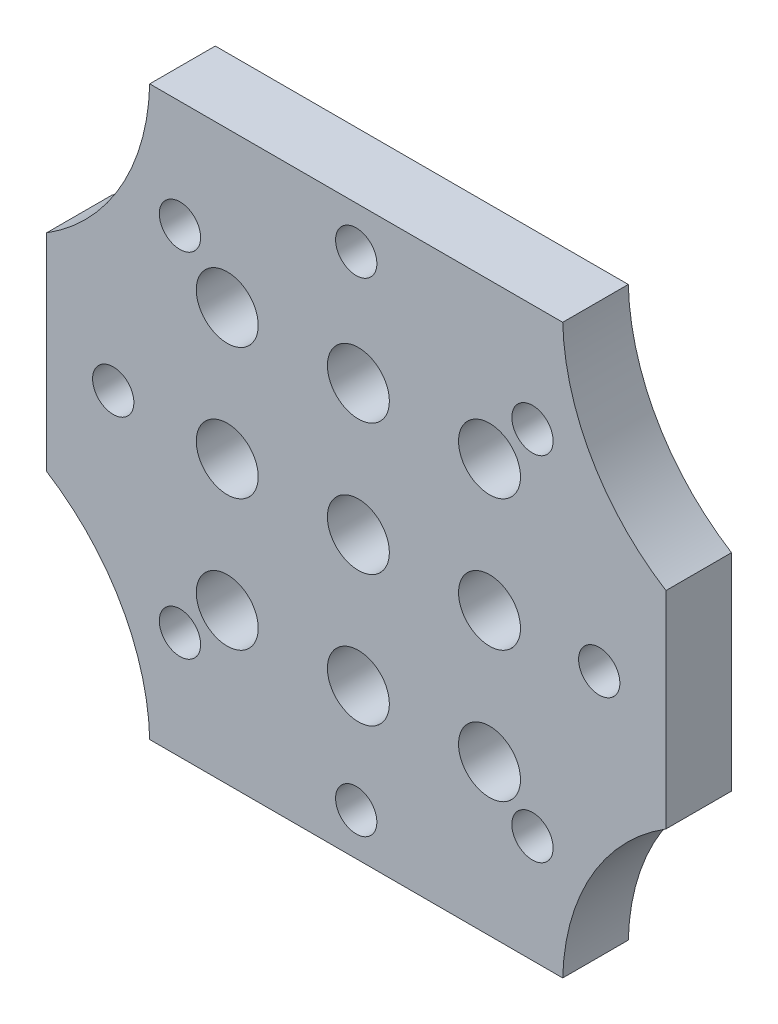
ISO-10303-21;
HEADER;
FILE_DESCRIPTION(('STEP AP214'),'2;1');
FILE_NAME('part.step','',(''),(''),'','','');
FILE_SCHEMA(('AUTOMOTIVE_DESIGN { 1 0 10303 214 1 1 1 1 }'));
ENDSEC;
DATA;
#1=APPLICATION_CONTEXT('core data for automotive mechanical design processes');
#2=APPLICATION_PROTOCOL_DEFINITION('international standard','automotive_design',2000,#1);
#3=PRODUCT_CONTEXT('',#1,'mechanical');
#4=PRODUCT('Part','Part','',(#3));
#5=PRODUCT_RELATED_PRODUCT_CATEGORY('part','',(#4));
#6=PRODUCT_DEFINITION_FORMATION('','',#4);
#7=PRODUCT_DEFINITION_CONTEXT('part definition',#1,'design');
#8=PRODUCT_DEFINITION('design','',#6,#7);
#9=PRODUCT_DEFINITION_SHAPE('','',#8);
#10=(LENGTH_UNIT() NAMED_UNIT(*) SI_UNIT(.MILLI.,.METRE.));
#11=(NAMED_UNIT(*) PLANE_ANGLE_UNIT() SI_UNIT($,.RADIAN.));
#12=(NAMED_UNIT(*) SI_UNIT($,.STERADIAN.) SOLID_ANGLE_UNIT());
#13=UNCERTAINTY_MEASURE_WITH_UNIT(LENGTH_MEASURE(1.E-05),#10,'distance_accuracy_value','');
#14=(GEOMETRIC_REPRESENTATION_CONTEXT(3) GLOBAL_UNCERTAINTY_ASSIGNED_CONTEXT((#13)) GLOBAL_UNIT_ASSIGNED_CONTEXT((#10,
#11,#12)) REPRESENTATION_CONTEXT('',''));
#15=CARTESIAN_POINT('',(0.,0.,0.));
#16=DIRECTION('',(0.,0.,1.));
#17=DIRECTION('',(1.,0.,0.));
#18=AXIS2_PLACEMENT_3D('',#15,#16,#17);
#19=CARTESIAN_POINT('',(30.,-27.5,6.35));
#20=DIRECTION('',(-1.,0.,0.));
#21=DIRECTION('',(0.,0.,1.));
#22=AXIS2_PLACEMENT_3D('',#19,#20,#21);
#23=PLANE('',#22);
#24=DIRECTION('',(0.,0.,1.));
#25=VECTOR('',#24,1.);
#26=CARTESIAN_POINT('',(30.,10.,0.));
#27=LINE('',#26,#25);
#28=CARTESIAN_POINT('',(30.,10.,0.));
#29=VERTEX_POINT('',#28);
#30=CARTESIAN_POINT('',(30.,10.,6.35));
#31=VERTEX_POINT('',#30);
#32=EDGE_CURVE('E161',#29,#31,#27,.T.);
#33=ORIENTED_EDGE('',*,*,#32,.T.);
#34=DIRECTION('',(0.,1.,0.));
#35=VECTOR('',#34,1.);
#36=CARTESIAN_POINT('',(30.,-27.5,6.35));
#37=LINE('',#36,#35);
#38=CARTESIAN_POINT('',(30.,-10.,6.35));
#39=VERTEX_POINT('',#38);
#40=EDGE_CURVE('E129',#39,#31,#37,.T.);
#41=ORIENTED_EDGE('',*,*,#40,.F.);
#42=DIRECTION('',(0.,0.,1.));
#43=VECTOR('',#42,1.);
#44=CARTESIAN_POINT('',(30.,-10.,0.));
#45=LINE('',#44,#43);
#46=CARTESIAN_POINT('',(30.,-10.,0.));
#47=VERTEX_POINT('',#46);
#48=EDGE_CURVE('E171',#47,#39,#45,.T.);
#49=ORIENTED_EDGE('',*,*,#48,.F.);
#50=DIRECTION('',(0.,1.,0.));
#51=VECTOR('',#50,1.);
#52=CARTESIAN_POINT('',(30.,-27.5,0.));
#53=LINE('',#52,#51);
#54=EDGE_CURVE('E138',#47,#29,#53,.T.);
#55=ORIENTED_EDGE('',*,*,#54,.T.);
#56=EDGE_LOOP('',(#33,#41,#49,#55));
#57=FACE_BOUND('',#56,.T.);
#58=ADVANCED_FACE('F43',(#57),#23,.F.);
#59=CARTESIAN_POINT('',(-30.,27.5,6.35));
#60=DIRECTION('',(0.,-1.,0.));
#61=DIRECTION('',(0.,0.,-1.));
#62=AXIS2_PLACEMENT_3D('',#59,#60,#61);
#63=PLANE('',#62);
#64=DIRECTION('',(0.,0.,1.));
#65=VECTOR('',#64,1.);
#66=CARTESIAN_POINT('',(20.,27.5,0.));
#67=LINE('',#66,#65);
#68=CARTESIAN_POINT('',(20.,27.5,0.));
#69=VERTEX_POINT('',#68);
#70=CARTESIAN_POINT('',(20.,27.5,6.35));
#71=VERTEX_POINT('',#70);
#72=EDGE_CURVE('E164',#69,#71,#67,.T.);
#73=ORIENTED_EDGE('',*,*,#72,.F.);
#74=DIRECTION('',(-1.,0.,0.));
#75=VECTOR('',#74,1.);
#76=CARTESIAN_POINT('',(-30.,27.5,0.));
#77=LINE('',#76,#75);
#78=CARTESIAN_POINT('',(-20.,27.5,0.));
#79=VERTEX_POINT('',#78);
#80=EDGE_CURVE('E134',#69,#79,#77,.T.);
#81=ORIENTED_EDGE('',*,*,#80,.T.);
#82=DIRECTION('',(0.,0.,1.));
#83=VECTOR('',#82,1.);
#84=CARTESIAN_POINT('',(-20.,27.5,0.));
#85=LINE('',#84,#83);
#86=CARTESIAN_POINT('',(-20.,27.5,6.35));
#87=VERTEX_POINT('',#86);
#88=EDGE_CURVE('E59',#79,#87,#85,.T.);
#89=ORIENTED_EDGE('',*,*,#88,.T.);
#90=DIRECTION('',(-1.,0.,0.));
#91=VECTOR('',#90,1.);
#92=CARTESIAN_POINT('',(-30.,27.5,6.35));
#93=LINE('',#92,#91);
#94=EDGE_CURVE('E132',#71,#87,#93,.T.);
#95=ORIENTED_EDGE('',*,*,#94,.F.);
#96=EDGE_LOOP('',(#73,#81,#89,#95));
#97=FACE_BOUND('',#96,.T.);
#98=ADVANCED_FACE('F327',(#97),#63,.F.);
#99=CARTESIAN_POINT('',(-30.,-27.5,6.35));
#100=DIRECTION('',(1.,0.,0.));
#101=DIRECTION('',(0.,0.,-1.));
#102=AXIS2_PLACEMENT_3D('',#99,#100,#101);
#103=PLANE('',#102);
#104=DIRECTION('',(0.,0.,1.));
#105=VECTOR('',#104,1.);
#106=CARTESIAN_POINT('',(-30.,-9.99999999999999,0.));
#107=LINE('',#106,#105);
#108=CARTESIAN_POINT('',(-30.,-9.99999999999999,0.));
#109=VERTEX_POINT('',#108);
#110=CARTESIAN_POINT('',(-30.,-9.99999999999999,6.35));
#111=VERTEX_POINT('',#110);
#112=EDGE_CURVE('E67',#109,#111,#107,.T.);
#113=ORIENTED_EDGE('',*,*,#112,.T.);
#114=DIRECTION('',(0.,-1.,0.));
#115=VECTOR('',#114,1.);
#116=CARTESIAN_POINT('',(-30.,-27.5,6.35));
#117=LINE('',#116,#115);
#118=CARTESIAN_POINT('',(-30.,9.99999999999999,6.35));
#119=VERTEX_POINT('',#118);
#120=EDGE_CURVE('E51',#119,#111,#117,.T.);
#121=ORIENTED_EDGE('',*,*,#120,.F.);
#122=DIRECTION('',(0.,0.,1.));
#123=VECTOR('',#122,1.);
#124=CARTESIAN_POINT('',(-30.,9.99999999999999,0.));
#125=LINE('',#124,#123);
#126=CARTESIAN_POINT('',(-30.,9.99999999999999,0.));
#127=VERTEX_POINT('',#126);
#128=EDGE_CURVE('E147',#127,#119,#125,.T.);
#129=ORIENTED_EDGE('',*,*,#128,.F.);
#130=DIRECTION('',(0.,-1.,0.));
#131=VECTOR('',#130,1.);
#132=CARTESIAN_POINT('',(-30.,-27.5,0.));
#133=LINE('',#132,#131);
#134=EDGE_CURVE('E130',#127,#109,#133,.T.);
#135=ORIENTED_EDGE('',*,*,#134,.T.);
#136=EDGE_LOOP('',(#113,#121,#129,#135));
#137=FACE_BOUND('',#136,.T.);
#138=ADVANCED_FACE('F331',(#137),#103,.F.);
#139=CARTESIAN_POINT('',(-30.,-27.5,6.35));
#140=DIRECTION('',(0.,1.,0.));
#141=DIRECTION('',(0.,0.,1.));
#142=AXIS2_PLACEMENT_3D('',#139,#140,#141);
#143=PLANE('',#142);
#144=DIRECTION('',(1.,0.,0.));
#145=VECTOR('',#144,1.);
#146=CARTESIAN_POINT('',(-30.,-27.5,0.));
#147=LINE('',#146,#145);
#148=CARTESIAN_POINT('',(-20.,-27.5,0.));
#149=VERTEX_POINT('',#148);
#150=CARTESIAN_POINT('',(20.,-27.5,0.));
#151=VERTEX_POINT('',#150);
#152=EDGE_CURVE('E46',#149,#151,#147,.T.);
#153=ORIENTED_EDGE('',*,*,#152,.T.);
#154=DIRECTION('',(0.,0.,1.));
#155=VECTOR('',#154,1.);
#156=CARTESIAN_POINT('',(20.,-27.5,0.));
#157=LINE('',#156,#155);
#158=CARTESIAN_POINT('',(20.,-27.5,6.35));
#159=VERTEX_POINT('',#158);
#160=EDGE_CURVE('E173',#151,#159,#157,.T.);
#161=ORIENTED_EDGE('',*,*,#160,.T.);
#162=DIRECTION('',(1.,0.,0.));
#163=VECTOR('',#162,1.);
#164=CARTESIAN_POINT('',(-30.,-27.5,6.35));
#165=LINE('',#164,#163);
#166=CARTESIAN_POINT('',(-20.,-27.5,6.35));
#167=VERTEX_POINT('',#166);
#168=EDGE_CURVE('E11',#167,#159,#165,.T.);
#169=ORIENTED_EDGE('',*,*,#168,.F.);
#170=DIRECTION('',(0.,0.,1.));
#171=VECTOR('',#170,1.);
#172=CARTESIAN_POINT('',(-20.,-27.5,0.));
#173=LINE('',#172,#171);
#174=EDGE_CURVE('E109',#149,#167,#173,.T.);
#175=ORIENTED_EDGE('',*,*,#174,.F.);
#176=EDGE_LOOP('',(#153,#161,#169,#175));
#177=FACE_BOUND('',#176,.T.);
#178=ADVANCED_FACE('F120',(#177),#143,.F.);
#179=CARTESIAN_POINT('',(0.,0.,6.35));
#180=DIRECTION('',(0.,0.,-1.));
#181=DIRECTION('',(-1.,0.,0.));
#182=AXIS2_PLACEMENT_3D('',#179,#180,#181);
#183=PLANE('',#182);
#184=CARTESIAN_POINT('',(-12.4909155258027,-12.9090844741973,6.35));
#185=DIRECTION('',(0.,0.,1.));
#186=DIRECTION('',(1.,0.,0.));
#187=AXIS2_PLACEMENT_3D('',#184,#185,#186);
#188=CIRCLE('',#187,3.);
#189=CARTESIAN_POINT('',(-9.49091552580268,-12.9090844741973,6.35));
#190=VERTEX_POINT('',#189);
#191=EDGE_CURVE('E269',#190,#190,#188,.T.);
#192=ORIENTED_EDGE('',*,*,#191,.F.);
#193=EDGE_LOOP('',(#192));
#194=FACE_BOUND('',#193,.T.);
#195=CARTESIAN_POINT('',(0.209084474197315,-12.9090844741973,6.35));
#196=DIRECTION('',(0.,0.,1.));
#197=DIRECTION('',(1.,0.,0.));
#198=AXIS2_PLACEMENT_3D('',#195,#196,#197);
#199=CIRCLE('',#198,3.);
#200=CARTESIAN_POINT('',(3.20908447419732,-12.9090844741973,6.35));
#201=VERTEX_POINT('',#200);
#202=EDGE_CURVE('E263',#201,#201,#199,.T.);
#203=ORIENTED_EDGE('',*,*,#202,.F.);
#204=EDGE_LOOP('',(#203));
#205=FACE_BOUND('',#204,.T.);
#206=CARTESIAN_POINT('',(12.9090844741973,-12.9090844741973,6.35));
#207=DIRECTION('',(0.,0.,1.));
#208=DIRECTION('',(1.,0.,0.));
#209=AXIS2_PLACEMENT_3D('',#206,#207,#208);
#210=CIRCLE('',#209,3.);
#211=CARTESIAN_POINT('',(15.9090844741973,-12.9090844741973,6.35));
#212=VERTEX_POINT('',#211);
#213=EDGE_CURVE('E257',#212,#212,#210,.T.);
#214=ORIENTED_EDGE('',*,*,#213,.F.);
#215=EDGE_LOOP('',(#214));
#216=FACE_BOUND('',#215,.T.);
#217=CARTESIAN_POINT('',(-12.4909155258027,-0.209084474197327,6.35));
#218=DIRECTION('',(0.,0.,1.));
#219=DIRECTION('',(1.,0.,0.));
#220=AXIS2_PLACEMENT_3D('',#217,#218,#219);
#221=CIRCLE('',#220,3.);
#222=CARTESIAN_POINT('',(-9.49091552580268,-0.209084474197327,6.35));
#223=VERTEX_POINT('',#222);
#224=EDGE_CURVE('E252',#223,#223,#221,.T.);
#225=ORIENTED_EDGE('',*,*,#224,.F.);
#226=EDGE_LOOP('',(#225));
#227=FACE_BOUND('',#226,.T.);
#228=CARTESIAN_POINT('',(0.209084474197319,-0.209084474197326,6.35));
#229=DIRECTION('',(0.,0.,1.));
#230=DIRECTION('',(1.,0.,0.));
#231=AXIS2_PLACEMENT_3D('',#228,#229,#230);
#232=CIRCLE('',#231,3.);
#233=CARTESIAN_POINT('',(3.20908447419732,-0.209084474197326,6.35));
#234=VERTEX_POINT('',#233);
#235=EDGE_CURVE('E246',#234,#234,#232,.T.);
#236=ORIENTED_EDGE('',*,*,#235,.F.);
#237=EDGE_LOOP('',(#236));
#238=FACE_BOUND('',#237,.T.);
#239=CARTESIAN_POINT('',(12.9090844741973,-0.209084474197322,6.35));
#240=DIRECTION('',(0.,0.,1.));
#241=DIRECTION('',(1.,0.,0.));
#242=AXIS2_PLACEMENT_3D('',#239,#240,#241);
#243=CIRCLE('',#242,3.);
#244=CARTESIAN_POINT('',(15.9090844741973,-0.209084474197322,6.35));
#245=VERTEX_POINT('',#244);
#246=EDGE_CURVE('E239',#245,#245,#243,.T.);
#247=ORIENTED_EDGE('',*,*,#246,.F.);
#248=EDGE_LOOP('',(#247));
#249=FACE_BOUND('',#248,.T.);
#250=CARTESIAN_POINT('',(0.209084474197324,12.4909155258027,6.35));
#251=DIRECTION('',(0.,0.,1.));
#252=DIRECTION('',(1.,0.,0.));
#253=AXIS2_PLACEMENT_3D('',#250,#251,#252);
#254=CIRCLE('',#253,3.);
#255=CARTESIAN_POINT('',(3.20908447419733,12.4909155258027,6.35));
#256=VERTEX_POINT('',#255);
#257=EDGE_CURVE('E234',#256,#256,#254,.T.);
#258=ORIENTED_EDGE('',*,*,#257,.F.);
#259=EDGE_LOOP('',(#258));
#260=FACE_BOUND('',#259,.T.);
#261=CARTESIAN_POINT('',(12.9090844741973,12.4909155258027,6.35));
#262=DIRECTION('',(0.,0.,1.));
#263=DIRECTION('',(1.,0.,0.));
#264=AXIS2_PLACEMENT_3D('',#261,#262,#263);
#265=CIRCLE('',#264,3.);
#266=CARTESIAN_POINT('',(15.9090844741973,12.4909155258027,6.35));
#267=VERTEX_POINT('',#266);
#268=EDGE_CURVE('E227',#267,#267,#265,.T.);
#269=ORIENTED_EDGE('',*,*,#268,.F.);
#270=EDGE_LOOP('',(#269));
#271=FACE_BOUND('',#270,.T.);
#272=CARTESIAN_POINT('',(-12.4909155258027,12.4909155258027,6.35));
#273=DIRECTION('',(0.,0.,1.));
#274=DIRECTION('',(1.,0.,0.));
#275=AXIS2_PLACEMENT_3D('',#272,#273,#274);
#276=CIRCLE('',#275,3.);
#277=CARTESIAN_POINT('',(-9.49091552580268,12.4909155258027,6.35));
#278=VERTEX_POINT('',#277);
#279=EDGE_CURVE('E221',#278,#278,#276,.T.);
#280=ORIENTED_EDGE('',*,*,#279,.F.);
#281=EDGE_LOOP('',(#280));
#282=FACE_BOUND('',#281,.T.);
#283=CARTESIAN_POINT('',(-23.535533905,0.,6.35));
#284=DIRECTION('',(0.,0.,1.));
#285=DIRECTION('',(1.,0.,0.));
#286=AXIS2_PLACEMENT_3D('',#283,#284,#285);
#287=CIRCLE('',#286,2.);
#288=CARTESIAN_POINT('',(-21.535533905,0.,6.35));
#289=VERTEX_POINT('',#288);
#290=EDGE_CURVE('E179',#289,#289,#287,.T.);
#291=ORIENTED_EDGE('',*,*,#290,.F.);
#292=EDGE_LOOP('',(#291));
#293=FACE_BOUND('',#292,.T.);
#294=CARTESIAN_POINT('',(-17.07106781,-17.07106781,6.35));
#295=DIRECTION('',(0.,0.,1.));
#296=DIRECTION('',(1.,0.,0.));
#297=AXIS2_PLACEMENT_3D('',#294,#295,#296);
#298=CIRCLE('',#297,2.);
#299=CARTESIAN_POINT('',(-15.07106781,-17.07106781,6.35));
#300=VERTEX_POINT('',#299);
#301=EDGE_CURVE('E186',#300,#300,#298,.T.);
#302=ORIENTED_EDGE('',*,*,#301,.F.);
#303=EDGE_LOOP('',(#302));
#304=FACE_BOUND('',#303,.T.);
#305=CARTESIAN_POINT('',(17.07106781,-17.07106781,6.35));
#306=DIRECTION('',(0.,0.,1.));
#307=DIRECTION('',(1.,0.,0.));
#308=AXIS2_PLACEMENT_3D('',#305,#306,#307);
#309=CIRCLE('',#308,2.);
#310=CARTESIAN_POINT('',(19.07106781,-17.07106781,6.35));
#311=VERTEX_POINT('',#310);
#312=EDGE_CURVE('E192',#311,#311,#309,.T.);
#313=ORIENTED_EDGE('',*,*,#312,.F.);
#314=EDGE_LOOP('',(#313));
#315=FACE_BOUND('',#314,.T.);
#316=CARTESIAN_POINT('',(23.535533905,0.,6.35));
#317=DIRECTION('',(0.,0.,1.));
#318=DIRECTION('',(1.,0.,0.));
#319=AXIS2_PLACEMENT_3D('',#316,#317,#318);
#320=CIRCLE('',#319,2.);
#321=CARTESIAN_POINT('',(25.535533905,0.,6.35));
#322=VERTEX_POINT('',#321);
#323=EDGE_CURVE('E198',#322,#322,#320,.T.);
#324=ORIENTED_EDGE('',*,*,#323,.F.);
#325=EDGE_LOOP('',(#324));
#326=FACE_BOUND('',#325,.T.);
#327=CARTESIAN_POINT('',(17.07106781,17.07106781,6.35));
#328=DIRECTION('',(0.,0.,1.));
#329=DIRECTION('',(1.,0.,0.));
#330=AXIS2_PLACEMENT_3D('',#327,#328,#329);
#331=CIRCLE('',#330,2.);
#332=CARTESIAN_POINT('',(19.07106781,17.07106781,6.35));
#333=VERTEX_POINT('',#332);
#334=EDGE_CURVE('E153',#333,#333,#331,.T.);
#335=ORIENTED_EDGE('',*,*,#334,.F.);
#336=EDGE_LOOP('',(#335));
#337=FACE_BOUND('',#336,.T.);
#338=CARTESIAN_POINT('',(-17.07106781,17.07106781,6.35));
#339=DIRECTION('',(0.,0.,1.));
#340=DIRECTION('',(1.,0.,0.));
#341=AXIS2_PLACEMENT_3D('',#338,#339,#340);
#342=CIRCLE('',#341,2.);
#343=CARTESIAN_POINT('',(-15.07106781,17.07106781,6.35));
#344=VERTEX_POINT('',#343);
#345=EDGE_CURVE('E216',#344,#344,#342,.T.);
#346=ORIENTED_EDGE('',*,*,#345,.F.);
#347=EDGE_LOOP('',(#346));
#348=FACE_BOUND('',#347,.T.);
#349=CARTESIAN_POINT('',(0.,-23.42106781,6.35));
#350=DIRECTION('',(0.,0.,1.));
#351=DIRECTION('',(1.,0.,0.));
#352=AXIS2_PLACEMENT_3D('',#349,#350,#351);
#353=CIRCLE('',#352,2.);
#354=CARTESIAN_POINT('',(2.00000000000001,-23.42106781,6.35));
#355=VERTEX_POINT('',#354);
#356=EDGE_CURVE('E210',#355,#355,#353,.T.);
#357=ORIENTED_EDGE('',*,*,#356,.F.);
#358=EDGE_LOOP('',(#357));
#359=FACE_BOUND('',#358,.T.);
#360=CARTESIAN_POINT('',(0.,23.42106781,6.35));
#361=DIRECTION('',(0.,0.,1.));
#362=DIRECTION('',(1.,0.,0.));
#363=AXIS2_PLACEMENT_3D('',#360,#361,#362);
#364=CIRCLE('',#363,2.);
#365=CARTESIAN_POINT('',(2.,23.42106781,6.35));
#366=VERTEX_POINT('',#365);
#367=EDGE_CURVE('E203',#366,#366,#364,.T.);
#368=ORIENTED_EDGE('',*,*,#367,.F.);
#369=EDGE_LOOP('',(#368));
#370=FACE_BOUND('',#369,.T.);
#371=CARTESIAN_POINT('',(41.2993778824678,28.0639302185531,6.35));
#372=DIRECTION('',(0.,0.,1.));
#373=DIRECTION('',(1.,0.,0.));
#374=AXIS2_PLACEMENT_3D('',#371,#372,#373);
#375=CIRCLE('',#374,21.306841987295);
#376=EDGE_CURVE('E160',#31,#71,#375,.F.);
#377=ORIENTED_EDGE('',*,*,#376,.T.);
#378=ORIENTED_EDGE('',*,*,#94,.T.);
#379=CARTESIAN_POINT('',(-41.2993778824678,28.0639302185531,6.35));
#380=DIRECTION('',(0.,0.,1.));
#381=DIRECTION('',(1.,0.,0.));
#382=AXIS2_PLACEMENT_3D('',#379,#380,#381);
#383=CIRCLE('',#382,21.306841987295);
#384=EDGE_CURVE('E122',#119,#87,#383,.T.);
#385=ORIENTED_EDGE('',*,*,#384,.F.);
#386=ORIENTED_EDGE('',*,*,#120,.T.);
#387=CARTESIAN_POINT('',(-41.2993778824678,-28.0639302185531,6.35));
#388=DIRECTION('',(0.,0.,1.));
#389=DIRECTION('',(1.,0.,0.));
#390=AXIS2_PLACEMENT_3D('',#387,#388,#389);
#391=CIRCLE('',#390,21.306841987295);
#392=EDGE_CURVE('E115',#111,#167,#391,.F.);
#393=ORIENTED_EDGE('',*,*,#392,.T.);
#394=ORIENTED_EDGE('',*,*,#168,.T.);
#395=CARTESIAN_POINT('',(41.2993778824678,-28.0639302185531,6.35));
#396=DIRECTION('',(0.,0.,1.));
#397=DIRECTION('',(1.,0.,0.));
#398=AXIS2_PLACEMENT_3D('',#395,#396,#397);
#399=CIRCLE('',#398,21.306841987295);
#400=EDGE_CURVE('E167',#39,#159,#399,.T.);
#401=ORIENTED_EDGE('',*,*,#400,.F.);
#402=ORIENTED_EDGE('',*,*,#40,.T.);
#403=EDGE_LOOP('',(#377,#378,#385,#386,#393,#394,#401,#402));
#404=FACE_BOUND('',#403,.T.);
#405=ADVANCED_FACE('F284',(#194,#205,#216,#227,#238,#249,#260,#271,#282,#293,#304,#315,#326,
#337,#348,#359,#370,#404),#183,.F.);
#406=CARTESIAN_POINT('',(0.,0.,0.));
#407=DIRECTION('',(0.,0.,-1.));
#408=DIRECTION('',(-1.,0.,0.));
#409=AXIS2_PLACEMENT_3D('',#406,#407,#408);
#410=PLANE('',#409);
#411=CARTESIAN_POINT('',(-12.4909155258027,-12.9090844741973,0.));
#412=DIRECTION('',(0.,0.,1.));
#413=DIRECTION('',(1.,0.,0.));
#414=AXIS2_PLACEMENT_3D('',#411,#412,#413);
#415=CIRCLE('',#414,3.);
#416=CARTESIAN_POINT('',(-9.49091552580268,-12.9090844741973,0.));
#417=VERTEX_POINT('',#416);
#418=EDGE_CURVE('E243',#417,#417,#415,.T.);
#419=ORIENTED_EDGE('',*,*,#418,.T.);
#420=EDGE_LOOP('',(#419));
#421=FACE_BOUND('',#420,.T.);
#422=CARTESIAN_POINT('',(0.209084474197315,-12.9090844741973,0.));
#423=DIRECTION('',(0.,0.,1.));
#424=DIRECTION('',(1.,0.,0.));
#425=AXIS2_PLACEMENT_3D('',#422,#423,#424);
#426=CIRCLE('',#425,3.);
#427=CARTESIAN_POINT('',(3.20908447419732,-12.9090844741973,0.));
#428=VERTEX_POINT('',#427);
#429=EDGE_CURVE('E266',#428,#428,#426,.T.);
#430=ORIENTED_EDGE('',*,*,#429,.T.);
#431=EDGE_LOOP('',(#430));
#432=FACE_BOUND('',#431,.T.);
#433=CARTESIAN_POINT('',(12.9090844741973,-12.9090844741973,0.));
#434=DIRECTION('',(0.,0.,1.));
#435=DIRECTION('',(1.,0.,0.));
#436=AXIS2_PLACEMENT_3D('',#433,#434,#435);
#437=CIRCLE('',#436,3.);
#438=CARTESIAN_POINT('',(15.9090844741973,-12.9090844741973,0.));
#439=VERTEX_POINT('',#438);
#440=EDGE_CURVE('E260',#439,#439,#437,.T.);
#441=ORIENTED_EDGE('',*,*,#440,.T.);
#442=EDGE_LOOP('',(#441));
#443=FACE_BOUND('',#442,.T.);
#444=CARTESIAN_POINT('',(-12.4909155258027,-0.209084474197327,0.));
#445=DIRECTION('',(0.,0.,1.));
#446=DIRECTION('',(1.,0.,0.));
#447=AXIS2_PLACEMENT_3D('',#444,#445,#446);
#448=CIRCLE('',#447,3.);
#449=CARTESIAN_POINT('',(-9.49091552580268,-0.209084474197327,0.));
#450=VERTEX_POINT('',#449);
#451=EDGE_CURVE('E231',#450,#450,#448,.T.);
#452=ORIENTED_EDGE('',*,*,#451,.T.);
#453=EDGE_LOOP('',(#452));
#454=FACE_BOUND('',#453,.T.);
#455=CARTESIAN_POINT('',(0.209084474197319,-0.209084474197326,0.));
#456=DIRECTION('',(0.,0.,1.));
#457=DIRECTION('',(1.,0.,0.));
#458=AXIS2_PLACEMENT_3D('',#455,#456,#457);
#459=CIRCLE('',#458,3.);
#460=CARTESIAN_POINT('',(3.20908447419732,-0.209084474197326,0.));
#461=VERTEX_POINT('',#460);
#462=EDGE_CURVE('E249',#461,#461,#459,.T.);
#463=ORIENTED_EDGE('',*,*,#462,.T.);
#464=EDGE_LOOP('',(#463));
#465=FACE_BOUND('',#464,.T.);
#466=CARTESIAN_POINT('',(12.9090844741973,-0.209084474197322,0.));
#467=DIRECTION('',(0.,0.,1.));
#468=DIRECTION('',(1.,0.,0.));
#469=AXIS2_PLACEMENT_3D('',#466,#467,#468);
#470=CIRCLE('',#469,3.);
#471=CARTESIAN_POINT('',(15.9090844741973,-0.209084474197322,0.));
#472=VERTEX_POINT('',#471);
#473=EDGE_CURVE('E242',#472,#472,#470,.T.);
#474=ORIENTED_EDGE('',*,*,#473,.T.);
#475=EDGE_LOOP('',(#474));
#476=FACE_BOUND('',#475,.T.);
#477=CARTESIAN_POINT('',(0.209084474197324,12.4909155258027,0.));
#478=DIRECTION('',(0.,0.,1.));
#479=DIRECTION('',(1.,0.,0.));
#480=AXIS2_PLACEMENT_3D('',#477,#478,#479);
#481=CIRCLE('',#480,3.);
#482=CARTESIAN_POINT('',(3.20908447419733,12.4909155258027,0.));
#483=VERTEX_POINT('',#482);
#484=EDGE_CURVE('E224',#483,#483,#481,.T.);
#485=ORIENTED_EDGE('',*,*,#484,.T.);
#486=EDGE_LOOP('',(#485));
#487=FACE_BOUND('',#486,.T.);
#488=CARTESIAN_POINT('',(12.9090844741973,12.4909155258027,0.));
#489=DIRECTION('',(0.,0.,1.));
#490=DIRECTION('',(1.,0.,0.));
#491=AXIS2_PLACEMENT_3D('',#488,#489,#490);
#492=CIRCLE('',#491,3.);
#493=CARTESIAN_POINT('',(15.9090844741973,12.4909155258027,0.));
#494=VERTEX_POINT('',#493);
#495=EDGE_CURVE('E230',#494,#494,#492,.T.);
#496=ORIENTED_EDGE('',*,*,#495,.T.);
#497=EDGE_LOOP('',(#496));
#498=FACE_BOUND('',#497,.T.);
#499=CARTESIAN_POINT('',(-12.4909155258027,12.4909155258027,0.));
#500=DIRECTION('',(0.,0.,1.));
#501=DIRECTION('',(1.,0.,0.));
#502=AXIS2_PLACEMENT_3D('',#499,#500,#501);
#503=CIRCLE('',#502,3.);
#504=CARTESIAN_POINT('',(-9.49091552580268,12.4909155258027,0.));
#505=VERTEX_POINT('',#504);
#506=EDGE_CURVE('E207',#505,#505,#503,.T.);
#507=ORIENTED_EDGE('',*,*,#506,.T.);
#508=EDGE_LOOP('',(#507));
#509=FACE_BOUND('',#508,.T.);
#510=CARTESIAN_POINT('',(-23.535533905,0.,0.));
#511=DIRECTION('',(0.,0.,1.));
#512=DIRECTION('',(1.,0.,0.));
#513=AXIS2_PLACEMENT_3D('',#510,#511,#512);
#514=CIRCLE('',#513,2.);
#515=CARTESIAN_POINT('',(-21.535533905,0.,0.));
#516=VERTEX_POINT('',#515);
#517=EDGE_CURVE('E182',#516,#516,#514,.T.);
#518=ORIENTED_EDGE('',*,*,#517,.T.);
#519=EDGE_LOOP('',(#518));
#520=FACE_BOUND('',#519,.T.);
#521=CARTESIAN_POINT('',(-17.07106781,-17.07106781,0.));
#522=DIRECTION('',(0.,0.,1.));
#523=DIRECTION('',(1.,0.,0.));
#524=AXIS2_PLACEMENT_3D('',#521,#522,#523);
#525=CIRCLE('',#524,2.);
#526=CARTESIAN_POINT('',(-15.07106781,-17.07106781,0.));
#527=VERTEX_POINT('',#526);
#528=EDGE_CURVE('E189',#527,#527,#525,.T.);
#529=ORIENTED_EDGE('',*,*,#528,.T.);
#530=EDGE_LOOP('',(#529));
#531=FACE_BOUND('',#530,.T.);
#532=CARTESIAN_POINT('',(17.07106781,-17.07106781,0.));
#533=DIRECTION('',(0.,0.,1.));
#534=DIRECTION('',(1.,0.,0.));
#535=AXIS2_PLACEMENT_3D('',#532,#533,#534);
#536=CIRCLE('',#535,2.);
#537=CARTESIAN_POINT('',(19.07106781,-17.07106781,0.));
#538=VERTEX_POINT('',#537);
#539=EDGE_CURVE('E195',#538,#538,#536,.T.);
#540=ORIENTED_EDGE('',*,*,#539,.T.);
#541=EDGE_LOOP('',(#540));
#542=FACE_BOUND('',#541,.T.);
#543=CARTESIAN_POINT('',(23.535533905,0.,0.));
#544=DIRECTION('',(0.,0.,1.));
#545=DIRECTION('',(1.,0.,0.));
#546=AXIS2_PLACEMENT_3D('',#543,#544,#545);
#547=CIRCLE('',#546,2.);
#548=CARTESIAN_POINT('',(25.535533905,0.,0.));
#549=VERTEX_POINT('',#548);
#550=EDGE_CURVE('E157',#549,#549,#547,.T.);
#551=ORIENTED_EDGE('',*,*,#550,.T.);
#552=EDGE_LOOP('',(#551));
#553=FACE_BOUND('',#552,.T.);
#554=CARTESIAN_POINT('',(17.07106781,17.07106781,0.));
#555=DIRECTION('',(0.,0.,1.));
#556=DIRECTION('',(1.,0.,0.));
#557=AXIS2_PLACEMENT_3D('',#554,#555,#556);
#558=CIRCLE('',#557,2.);
#559=CARTESIAN_POINT('',(19.07106781,17.07106781,0.));
#560=VERTEX_POINT('',#559);
#561=EDGE_CURVE('E156',#560,#560,#558,.T.);
#562=ORIENTED_EDGE('',*,*,#561,.T.);
#563=EDGE_LOOP('',(#562));
#564=FACE_BOUND('',#563,.T.);
#565=CARTESIAN_POINT('',(-17.07106781,17.07106781,0.));
#566=DIRECTION('',(0.,0.,1.));
#567=DIRECTION('',(1.,0.,0.));
#568=AXIS2_PLACEMENT_3D('',#565,#566,#567);
#569=CIRCLE('',#568,2.);
#570=CARTESIAN_POINT('',(-15.07106781,17.07106781,0.));
#571=VERTEX_POINT('',#570);
#572=EDGE_CURVE('E183',#571,#571,#569,.T.);
#573=ORIENTED_EDGE('',*,*,#572,.T.);
#574=EDGE_LOOP('',(#573));
#575=FACE_BOUND('',#574,.T.);
#576=CARTESIAN_POINT('',(0.,-23.42106781,0.));
#577=DIRECTION('',(0.,0.,1.));
#578=DIRECTION('',(1.,0.,0.));
#579=AXIS2_PLACEMENT_3D('',#576,#577,#578);
#580=CIRCLE('',#579,2.);
#581=CARTESIAN_POINT('',(2.00000000000001,-23.42106781,0.));
#582=VERTEX_POINT('',#581);
#583=EDGE_CURVE('E213',#582,#582,#580,.T.);
#584=ORIENTED_EDGE('',*,*,#583,.T.);
#585=EDGE_LOOP('',(#584));
#586=FACE_BOUND('',#585,.T.);
#587=CARTESIAN_POINT('',(0.,23.42106781,0.));
#588=DIRECTION('',(0.,0.,1.));
#589=DIRECTION('',(1.,0.,0.));
#590=AXIS2_PLACEMENT_3D('',#587,#588,#589);
#591=CIRCLE('',#590,2.);
#592=CARTESIAN_POINT('',(2.,23.42106781,0.));
#593=VERTEX_POINT('',#592);
#594=EDGE_CURVE('E206',#593,#593,#591,.T.);
#595=ORIENTED_EDGE('',*,*,#594,.T.);
#596=EDGE_LOOP('',(#595));
#597=FACE_BOUND('',#596,.T.);
#598=ORIENTED_EDGE('',*,*,#80,.F.);
#599=CARTESIAN_POINT('',(41.2993778824678,28.0639302185531,0.));
#600=DIRECTION('',(0.,0.,1.));
#601=DIRECTION('',(1.,0.,0.));
#602=AXIS2_PLACEMENT_3D('',#599,#600,#601);
#603=CIRCLE('',#602,21.306841987295);
#604=EDGE_CURVE('E165',#29,#69,#603,.F.);
#605=ORIENTED_EDGE('',*,*,#604,.F.);
#606=ORIENTED_EDGE('',*,*,#54,.F.);
#607=CARTESIAN_POINT('',(41.2993778824678,-28.0639302185531,0.));
#608=DIRECTION('',(0.,0.,1.));
#609=DIRECTION('',(1.,0.,0.));
#610=AXIS2_PLACEMENT_3D('',#607,#608,#609);
#611=CIRCLE('',#610,21.306841987295);
#612=EDGE_CURVE('E128',#47,#151,#611,.T.);
#613=ORIENTED_EDGE('',*,*,#612,.T.);
#614=ORIENTED_EDGE('',*,*,#152,.F.);
#615=CARTESIAN_POINT('',(-41.2993778824678,-28.0639302185531,0.));
#616=DIRECTION('',(0.,0.,1.));
#617=DIRECTION('',(1.,0.,0.));
#618=AXIS2_PLACEMENT_3D('',#615,#616,#617);
#619=CIRCLE('',#618,21.306841987295);
#620=EDGE_CURVE('E106',#109,#149,#619,.F.);
#621=ORIENTED_EDGE('',*,*,#620,.F.);
#622=ORIENTED_EDGE('',*,*,#134,.F.);
#623=CARTESIAN_POINT('',(-41.2993778824678,28.0639302185531,0.));
#624=DIRECTION('',(0.,0.,1.));
#625=DIRECTION('',(1.,0.,0.));
#626=AXIS2_PLACEMENT_3D('',#623,#624,#625);
#627=CIRCLE('',#626,21.306841987295);
#628=EDGE_CURVE('E149',#127,#79,#627,.T.);
#629=ORIENTED_EDGE('',*,*,#628,.T.);
#630=EDGE_LOOP('',(#598,#605,#606,#613,#614,#621,#622,#629));
#631=FACE_BOUND('',#630,.T.);
#632=ADVANCED_FACE('F126',(#421,#432,#443,#454,#465,#476,#487,#498,#509,#520,#531,#542,#553,
#564,#575,#586,#597,#631),#410,.T.);
#633=CARTESIAN_POINT('',(-41.2993778824678,28.0639302185531,0.));
#634=DIRECTION('',(0.,0.,1.));
#635=DIRECTION('',(1.,0.,0.));
#636=AXIS2_PLACEMENT_3D('',#633,#634,#635);
#637=CYLINDRICAL_SURFACE('',#636,21.306841987295);
#638=ORIENTED_EDGE('',*,*,#384,.T.);
#639=ORIENTED_EDGE('',*,*,#88,.F.);
#640=ORIENTED_EDGE('',*,*,#628,.F.);
#641=ORIENTED_EDGE('',*,*,#128,.T.);
#642=EDGE_LOOP('',(#638,#639,#640,#641));
#643=FACE_BOUND('',#642,.T.);
#644=ADVANCED_FACE('F329',(#643),#637,.F.);
#645=CARTESIAN_POINT('',(0.,23.42106781,0.));
#646=DIRECTION('',(0.,0.,1.));
#647=DIRECTION('',(1.,0.,0.));
#648=AXIS2_PLACEMENT_3D('',#645,#646,#647);
#649=CYLINDRICAL_SURFACE('',#648,2.);
#650=ORIENTED_EDGE('',*,*,#594,.F.);
#651=EDGE_LOOP('',(#650));
#652=FACE_BOUND('',#651,.T.);
#653=ORIENTED_EDGE('',*,*,#367,.T.);
#654=EDGE_LOOP('',(#653));
#655=FACE_BOUND('',#654,.T.);
#656=ADVANCED_FACE('F362',(#652,#655),#649,.F.);
#657=CARTESIAN_POINT('',(0.,-23.42106781,0.));
#658=DIRECTION('',(0.,0.,1.));
#659=DIRECTION('',(1.,0.,0.));
#660=AXIS2_PLACEMENT_3D('',#657,#658,#659);
#661=CYLINDRICAL_SURFACE('',#660,2.);
#662=ORIENTED_EDGE('',*,*,#583,.F.);
#663=EDGE_LOOP('',(#662));
#664=FACE_BOUND('',#663,.T.);
#665=ORIENTED_EDGE('',*,*,#356,.T.);
#666=EDGE_LOOP('',(#665));
#667=FACE_BOUND('',#666,.T.);
#668=ADVANCED_FACE('F366',(#664,#667),#661,.F.);
#669=CARTESIAN_POINT('',(-17.07106781,17.07106781,0.));
#670=DIRECTION('',(0.,0.,1.));
#671=DIRECTION('',(1.,0.,0.));
#672=AXIS2_PLACEMENT_3D('',#669,#670,#671);
#673=CYLINDRICAL_SURFACE('',#672,2.);
#674=ORIENTED_EDGE('',*,*,#572,.F.);
#675=EDGE_LOOP('',(#674));
#676=FACE_BOUND('',#675,.T.);
#677=ORIENTED_EDGE('',*,*,#345,.T.);
#678=EDGE_LOOP('',(#677));
#679=FACE_BOUND('',#678,.T.);
#680=ADVANCED_FACE('F372',(#676,#679),#673,.F.);
#681=CARTESIAN_POINT('',(-41.2993778824678,-28.0639302185531,0.));
#682=DIRECTION('',(0.,0.,1.));
#683=DIRECTION('',(1.,0.,0.));
#684=AXIS2_PLACEMENT_3D('',#681,#682,#683);
#685=CYLINDRICAL_SURFACE('',#684,21.306841987295);
#686=ORIENTED_EDGE('',*,*,#392,.F.);
#687=ORIENTED_EDGE('',*,*,#112,.F.);
#688=ORIENTED_EDGE('',*,*,#620,.T.);
#689=ORIENTED_EDGE('',*,*,#174,.T.);
#690=EDGE_LOOP('',(#686,#687,#688,#689));
#691=FACE_BOUND('',#690,.T.);
#692=ADVANCED_FACE('F108',(#691),#685,.F.);
#693=CARTESIAN_POINT('',(41.2993778824678,-28.0639302185531,0.));
#694=DIRECTION('',(0.,0.,1.));
#695=DIRECTION('',(1.,0.,0.));
#696=AXIS2_PLACEMENT_3D('',#693,#694,#695);
#697=CYLINDRICAL_SURFACE('',#696,21.306841987295);
#698=ORIENTED_EDGE('',*,*,#400,.T.);
#699=ORIENTED_EDGE('',*,*,#160,.F.);
#700=ORIENTED_EDGE('',*,*,#612,.F.);
#701=ORIENTED_EDGE('',*,*,#48,.T.);
#702=EDGE_LOOP('',(#698,#699,#700,#701));
#703=FACE_BOUND('',#702,.T.);
#704=ADVANCED_FACE('F338',(#703),#697,.F.);
#705=CARTESIAN_POINT('',(41.2993778824678,28.0639302185531,0.));
#706=DIRECTION('',(0.,0.,1.));
#707=DIRECTION('',(1.,0.,0.));
#708=AXIS2_PLACEMENT_3D('',#705,#706,#707);
#709=CYLINDRICAL_SURFACE('',#708,21.306841987295);
#710=ORIENTED_EDGE('',*,*,#376,.F.);
#711=ORIENTED_EDGE('',*,*,#32,.F.);
#712=ORIENTED_EDGE('',*,*,#604,.T.);
#713=ORIENTED_EDGE('',*,*,#72,.T.);
#714=EDGE_LOOP('',(#710,#711,#712,#713));
#715=FACE_BOUND('',#714,.T.);
#716=ADVANCED_FACE('F335',(#715),#709,.F.);
#717=CARTESIAN_POINT('',(17.07106781,17.07106781,0.));
#718=DIRECTION('',(0.,0.,1.));
#719=DIRECTION('',(1.,0.,0.));
#720=AXIS2_PLACEMENT_3D('',#717,#718,#719);
#721=CYLINDRICAL_SURFACE('',#720,2.);
#722=ORIENTED_EDGE('',*,*,#561,.F.);
#723=EDGE_LOOP('',(#722));
#724=FACE_BOUND('',#723,.T.);
#725=ORIENTED_EDGE('',*,*,#334,.T.);
#726=EDGE_LOOP('',(#725));
#727=FACE_BOUND('',#726,.T.);
#728=ADVANCED_FACE('F337',(#724,#727),#721,.F.);
#729=CARTESIAN_POINT('',(23.535533905,0.,0.));
#730=DIRECTION('',(0.,0.,1.));
#731=DIRECTION('',(1.,0.,0.));
#732=AXIS2_PLACEMENT_3D('',#729,#730,#731);
#733=CYLINDRICAL_SURFACE('',#732,2.);
#734=ORIENTED_EDGE('',*,*,#550,.F.);
#735=EDGE_LOOP('',(#734));
#736=FACE_BOUND('',#735,.T.);
#737=ORIENTED_EDGE('',*,*,#323,.T.);
#738=EDGE_LOOP('',(#737));
#739=FACE_BOUND('',#738,.T.);
#740=ADVANCED_FACE('F344',(#736,#739),#733,.F.);
#741=CARTESIAN_POINT('',(17.07106781,-17.07106781,0.));
#742=DIRECTION('',(0.,0.,1.));
#743=DIRECTION('',(1.,0.,0.));
#744=AXIS2_PLACEMENT_3D('',#741,#742,#743);
#745=CYLINDRICAL_SURFACE('',#744,2.);
#746=ORIENTED_EDGE('',*,*,#539,.F.);
#747=EDGE_LOOP('',(#746));
#748=FACE_BOUND('',#747,.T.);
#749=ORIENTED_EDGE('',*,*,#312,.T.);
#750=EDGE_LOOP('',(#749));
#751=FACE_BOUND('',#750,.T.);
#752=ADVANCED_FACE('F381',(#748,#751),#745,.F.);
#753=CARTESIAN_POINT('',(-17.07106781,-17.07106781,0.));
#754=DIRECTION('',(0.,0.,1.));
#755=DIRECTION('',(1.,0.,0.));
#756=AXIS2_PLACEMENT_3D('',#753,#754,#755);
#757=CYLINDRICAL_SURFACE('',#756,2.);
#758=ORIENTED_EDGE('',*,*,#528,.F.);
#759=EDGE_LOOP('',(#758));
#760=FACE_BOUND('',#759,.T.);
#761=ORIENTED_EDGE('',*,*,#301,.T.);
#762=EDGE_LOOP('',(#761));
#763=FACE_BOUND('',#762,.T.);
#764=ADVANCED_FACE('F385',(#760,#763),#757,.F.);
#765=CARTESIAN_POINT('',(-23.535533905,0.,0.));
#766=DIRECTION('',(0.,0.,1.));
#767=DIRECTION('',(1.,0.,0.));
#768=AXIS2_PLACEMENT_3D('',#765,#766,#767);
#769=CYLINDRICAL_SURFACE('',#768,2.);
#770=ORIENTED_EDGE('',*,*,#517,.F.);
#771=EDGE_LOOP('',(#770));
#772=FACE_BOUND('',#771,.T.);
#773=ORIENTED_EDGE('',*,*,#290,.T.);
#774=EDGE_LOOP('',(#773));
#775=FACE_BOUND('',#774,.T.);
#776=ADVANCED_FACE('F389',(#772,#775),#769,.F.);
#777=CARTESIAN_POINT('',(-12.4909155258027,12.4909155258027,0.));
#778=DIRECTION('',(0.,0.,1.));
#779=DIRECTION('',(1.,0.,0.));
#780=AXIS2_PLACEMENT_3D('',#777,#778,#779);
#781=CYLINDRICAL_SURFACE('',#780,3.);
#782=ORIENTED_EDGE('',*,*,#506,.F.);
#783=EDGE_LOOP('',(#782));
#784=FACE_BOUND('',#783,.T.);
#785=ORIENTED_EDGE('',*,*,#279,.T.);
#786=EDGE_LOOP('',(#785));
#787=FACE_BOUND('',#786,.T.);
#788=ADVANCED_FACE('F393',(#784,#787),#781,.F.);
#789=CARTESIAN_POINT('',(12.9090844741973,12.4909155258027,0.));
#790=DIRECTION('',(0.,0.,1.));
#791=DIRECTION('',(1.,0.,0.));
#792=AXIS2_PLACEMENT_3D('',#789,#790,#791);
#793=CYLINDRICAL_SURFACE('',#792,3.);
#794=ORIENTED_EDGE('',*,*,#495,.F.);
#795=EDGE_LOOP('',(#794));
#796=FACE_BOUND('',#795,.T.);
#797=ORIENTED_EDGE('',*,*,#268,.T.);
#798=EDGE_LOOP('',(#797));
#799=FACE_BOUND('',#798,.T.);
#800=ADVANCED_FACE('F407',(#796,#799),#793,.F.);
#801=CARTESIAN_POINT('',(0.209084474197324,12.4909155258027,0.));
#802=DIRECTION('',(0.,0.,1.));
#803=DIRECTION('',(1.,0.,0.));
#804=AXIS2_PLACEMENT_3D('',#801,#802,#803);
#805=CYLINDRICAL_SURFACE('',#804,3.);
#806=ORIENTED_EDGE('',*,*,#484,.F.);
#807=EDGE_LOOP('',(#806));
#808=FACE_BOUND('',#807,.T.);
#809=ORIENTED_EDGE('',*,*,#257,.T.);
#810=EDGE_LOOP('',(#809));
#811=FACE_BOUND('',#810,.T.);
#812=ADVANCED_FACE('F411',(#808,#811),#805,.F.);
#813=CARTESIAN_POINT('',(12.9090844741973,-0.209084474197322,0.));
#814=DIRECTION('',(0.,0.,1.));
#815=DIRECTION('',(1.,0.,0.));
#816=AXIS2_PLACEMENT_3D('',#813,#814,#815);
#817=CYLINDRICAL_SURFACE('',#816,3.);
#818=ORIENTED_EDGE('',*,*,#473,.F.);
#819=EDGE_LOOP('',(#818));
#820=FACE_BOUND('',#819,.T.);
#821=ORIENTED_EDGE('',*,*,#246,.T.);
#822=EDGE_LOOP('',(#821));
#823=FACE_BOUND('',#822,.T.);
#824=ADVANCED_FACE('F415',(#820,#823),#817,.F.);
#825=CARTESIAN_POINT('',(0.209084474197319,-0.209084474197326,0.));
#826=DIRECTION('',(0.,0.,1.));
#827=DIRECTION('',(1.,0.,0.));
#828=AXIS2_PLACEMENT_3D('',#825,#826,#827);
#829=CYLINDRICAL_SURFACE('',#828,3.);
#830=ORIENTED_EDGE('',*,*,#462,.F.);
#831=EDGE_LOOP('',(#830));
#832=FACE_BOUND('',#831,.T.);
#833=ORIENTED_EDGE('',*,*,#235,.T.);
#834=EDGE_LOOP('',(#833));
#835=FACE_BOUND('',#834,.T.);
#836=ADVANCED_FACE('F419',(#832,#835),#829,.F.);
#837=CARTESIAN_POINT('',(-12.4909155258027,-0.209084474197327,0.));
#838=DIRECTION('',(0.,0.,1.));
#839=DIRECTION('',(1.,0.,0.));
#840=AXIS2_PLACEMENT_3D('',#837,#838,#839);
#841=CYLINDRICAL_SURFACE('',#840,3.);
#842=ORIENTED_EDGE('',*,*,#451,.F.);
#843=EDGE_LOOP('',(#842));
#844=FACE_BOUND('',#843,.T.);
#845=ORIENTED_EDGE('',*,*,#224,.T.);
#846=EDGE_LOOP('',(#845));
#847=FACE_BOUND('',#846,.T.);
#848=ADVANCED_FACE('F423',(#844,#847),#841,.F.);
#849=CARTESIAN_POINT('',(12.9090844741973,-12.9090844741973,0.));
#850=DIRECTION('',(0.,0.,1.));
#851=DIRECTION('',(1.,0.,0.));
#852=AXIS2_PLACEMENT_3D('',#849,#850,#851);
#853=CYLINDRICAL_SURFACE('',#852,3.);
#854=ORIENTED_EDGE('',*,*,#440,.F.);
#855=EDGE_LOOP('',(#854));
#856=FACE_BOUND('',#855,.T.);
#857=ORIENTED_EDGE('',*,*,#213,.T.);
#858=EDGE_LOOP('',(#857));
#859=FACE_BOUND('',#858,.T.);
#860=ADVANCED_FACE('F427',(#856,#859),#853,.F.);
#861=CARTESIAN_POINT('',(0.209084474197315,-12.9090844741973,0.));
#862=DIRECTION('',(0.,0.,1.));
#863=DIRECTION('',(1.,0.,0.));
#864=AXIS2_PLACEMENT_3D('',#861,#862,#863);
#865=CYLINDRICAL_SURFACE('',#864,3.);
#866=ORIENTED_EDGE('',*,*,#429,.F.);
#867=EDGE_LOOP('',(#866));
#868=FACE_BOUND('',#867,.T.);
#869=ORIENTED_EDGE('',*,*,#202,.T.);
#870=EDGE_LOOP('',(#869));
#871=FACE_BOUND('',#870,.T.);
#872=ADVANCED_FACE('F280',(#868,#871),#865,.F.);
#873=CARTESIAN_POINT('',(-12.4909155258027,-12.9090844741973,0.));
#874=DIRECTION('',(0.,0.,1.));
#875=DIRECTION('',(1.,0.,0.));
#876=AXIS2_PLACEMENT_3D('',#873,#874,#875);
#877=CYLINDRICAL_SURFACE('',#876,3.);
#878=ORIENTED_EDGE('',*,*,#418,.F.);
#879=EDGE_LOOP('',(#878));
#880=FACE_BOUND('',#879,.T.);
#881=ORIENTED_EDGE('',*,*,#191,.T.);
#882=EDGE_LOOP('',(#881));
#883=FACE_BOUND('',#882,.T.);
#884=ADVANCED_FACE('F277',(#880,#883),#877,.F.);
#885=CLOSED_SHELL('',(#58,#98,#138,#178,#405,#632,#644,#656,#668,#680,#692,#704,#716,#728,#740,
#752,#764,#776,#788,#800,#812,#824,#836,#848,#860,#872,#884));
#886=MANIFOLD_SOLID_BREP('B2',#885);
#887=ADVANCED_BREP_SHAPE_REPRESENTATION('',(#18,#886),#14);
#888=SHAPE_DEFINITION_REPRESENTATION(#9,#887);
ENDSEC;
END-ISO-10303-21;
